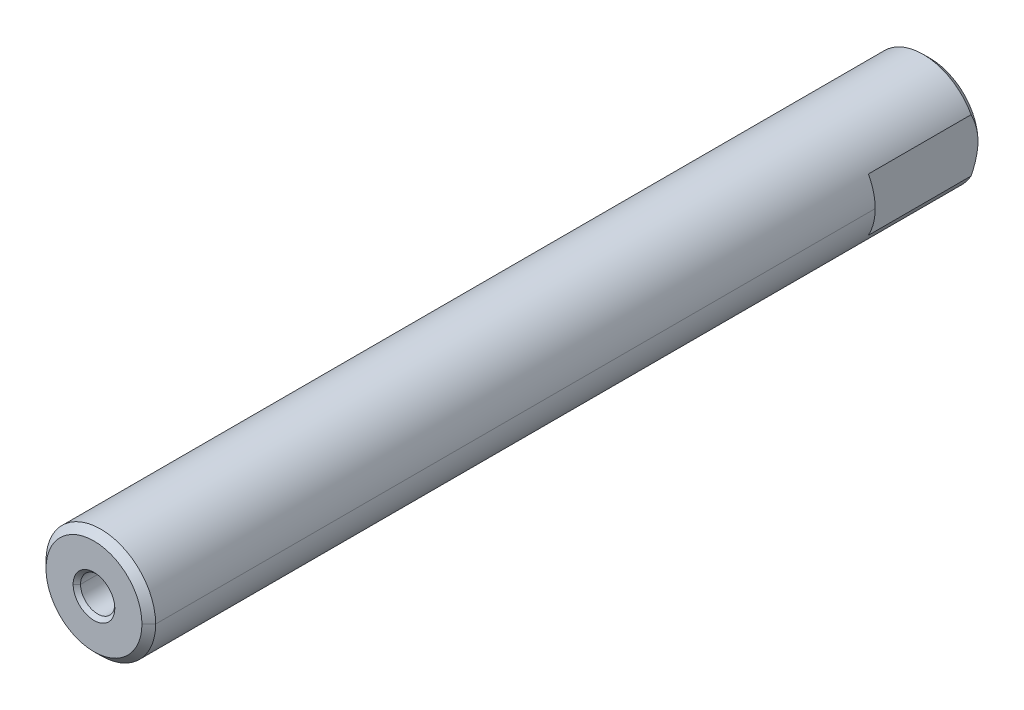
ISO-10303-21;
HEADER;
FILE_DESCRIPTION(('STEP AP214'),'2;1');
FILE_NAME('part.step','',(''),(''),'','','');
FILE_SCHEMA(('AUTOMOTIVE_DESIGN { 1 0 10303 214 1 1 1 1 }'));
ENDSEC;
DATA;
#1=APPLICATION_CONTEXT('core data for automotive mechanical design processes');
#2=APPLICATION_PROTOCOL_DEFINITION('international standard','automotive_design',2000,#1);
#3=PRODUCT_CONTEXT('',#1,'mechanical');
#4=PRODUCT('Part','Part','',(#3));
#5=PRODUCT_RELATED_PRODUCT_CATEGORY('part','',(#4));
#6=PRODUCT_DEFINITION_FORMATION('','',#4);
#7=PRODUCT_DEFINITION_CONTEXT('part definition',#1,'design');
#8=PRODUCT_DEFINITION('design','',#6,#7);
#9=PRODUCT_DEFINITION_SHAPE('','',#8);
#10=(LENGTH_UNIT() NAMED_UNIT(*) SI_UNIT(.MILLI.,.METRE.));
#11=(NAMED_UNIT(*) PLANE_ANGLE_UNIT() SI_UNIT($,.RADIAN.));
#12=(NAMED_UNIT(*) SI_UNIT($,.STERADIAN.) SOLID_ANGLE_UNIT());
#13=UNCERTAINTY_MEASURE_WITH_UNIT(LENGTH_MEASURE(1.E-05),#10,'distance_accuracy_value','');
#14=(GEOMETRIC_REPRESENTATION_CONTEXT(3) GLOBAL_UNCERTAINTY_ASSIGNED_CONTEXT((#13)) GLOBAL_UNIT_ASSIGNED_CONTEXT((#10,
#11,#12)) REPRESENTATION_CONTEXT('',''));
#15=CARTESIAN_POINT('',(0.,0.,0.));
#16=DIRECTION('',(0.,0.,1.));
#17=DIRECTION('',(1.,0.,0.));
#18=AXIS2_PLACEMENT_3D('',#15,#16,#17);
#19=CARTESIAN_POINT('',(3.5,4.88621935412864,8.));
#20=DIRECTION('',(1.,0.,0.));
#21=DIRECTION('',(0.,-1.,0.));
#22=AXIS2_PLACEMENT_3D('',#19,#20,#21);
#23=PLANE('',#22);
#24=DIRECTION('',(0.,0.,-1.));
#25=VECTOR('',#24,1.);
#26=CARTESIAN_POINT('',(3.5,-1.93649167310371,61.));
#27=LINE('',#26,#25);
#28=CARTESIAN_POINT('',(3.5,-1.93649167310371,8.));
#29=VERTEX_POINT('',#28);
#30=CARTESIAN_POINT('',(3.5,-1.93649167310371,0.500000000000063));
#31=VERTEX_POINT('',#30);
#32=EDGE_CURVE('E286',#29,#31,#27,.T.);
#33=ORIENTED_EDGE('',*,*,#32,.T.);
#34=CARTESIAN_POINT('',(3.49999999999997,0.,0.));
#35=CARTESIAN_POINT('',(3.4999942341956,-0.055561953894157,-1.30702272290945E-05));
#36=CARTESIAN_POINT('',(3.49999572668374,-0.111121671784973,0.00131852479242001));
#37=CARTESIAN_POINT('',(3.50000799050647,-0.22225127692022,0.00661908997414918));
#38=CARTESIAN_POINT('',(3.50001878443972,-0.277820859120701,0.0105944780899212));
#39=CARTESIAN_POINT('',(3.50004450680764,-0.389217556624111,0.0211781292325258));
#40=CARTESIAN_POINT('',(3.50005947197885,-0.44504241253058,0.0278100263985487));
#41=CARTESIAN_POINT('',(3.50005921828747,-0.555633468360331,0.0434708609195584));
#42=CARTESIAN_POINT('',(3.50004437853958,-0.610404130822807,0.0524684418748173));
#43=CARTESIAN_POINT('',(3.50001919201982,-0.719999500198233,0.0728991674522436));
#44=CARTESIAN_POINT('',(3.50000888698477,-0.774820237876483,0.0843535501568819));
#45=CARTESIAN_POINT('',(3.5000011573234,-0.88472023903095,0.109686665736827));
#46=CARTESIAN_POINT('',(3.5000039184471,-0.939792043411463,0.12359763742228));
#47=CARTESIAN_POINT('',(3.49999629995618,-1.04630054982865,0.152703499742868));
#48=CARTESIAN_POINT('',(3.49998664419175,-1.09776877426429,0.167783612004996));
#49=CARTESIAN_POINT('',(3.49996326392522,-1.20089778451425,0.199927441460859));
#50=CARTESIAN_POINT('',(3.49994948262865,-1.25255060021071,0.217016680074359));
#51=CARTESIAN_POINT('',(3.49993156376788,-1.3561763762825,0.253176782733719));
#52=CARTESIAN_POINT('',(3.49992760004896,-1.40813899389329,0.27227720892909));
#53=CARTESIAN_POINT('',(3.49993019638309,-1.51250518018266,0.312455524129849));
#54=CARTESIAN_POINT('',(3.49993697160304,-1.56489630236569,0.333565673385698));
#55=CARTESIAN_POINT('',(3.49995658221917,-1.67023045290168,0.377760651516999));
#56=CARTESIAN_POINT('',(3.49996955094969,-1.72315924712211,0.400879296628176));
#57=CARTESIAN_POINT('',(3.49999114662065,-1.82967262935075,0.44909286941947));
#58=CARTESIAN_POINT('',(3.49999965968975,-1.88324162537051,0.474222290335893));
#59=CARTESIAN_POINT('',(3.5,-1.9364916731037,0.500000000000063));
#60=B_SPLINE_CURVE_WITH_KNOTS('',3,(#34,#35,#36,#37,#38,#39,#40,#41,#42,#43,#44,#45,#46,#47,#48,
#49,#50,#51,#52,#53,#54,#55,#56,#57,#58,#59),.UNSPECIFIED.,.F.,.F.,(4,2,2,2,2,2,2,2,2,2,2,2,4),
(0.,0.166666050412799,0.333738175955924,0.502330930544102,0.668792788660832,0.836756231226204,
1.0071145760917,1.16797762335205,1.33116587892634,1.49722377746485,1.66665111117138,
1.8399026403733,2.01738884059167),.UNSPECIFIED.);
#61=CARTESIAN_POINT('',(3.5,0.,0.));
#62=VERTEX_POINT('',#61);
#63=EDGE_CURVE('E51',#62,#31,#60,.T.);
#64=ORIENTED_EDGE('',*,*,#63,.F.);
#65=CARTESIAN_POINT('',(3.49999999999964,1.93649167310487,0.500000000000311));
#66=CARTESIAN_POINT('',(3.49999633796739,1.85725073251888,0.461643561513497));
#67=CARTESIAN_POINT('',(3.49998014987611,1.77729228376771,0.424713309217628));
#68=CARTESIAN_POINT('',(3.49994945600047,1.61864369549973,0.355478896279381));
#69=CARTESIAN_POINT('',(3.49993491163544,1.54000355663685,0.323059791368042));
#70=CARTESIAN_POINT('',(3.49993056595035,1.38363011274289,0.262831423624858));
#71=CARTESIAN_POINT('',(3.49994004639073,1.30593864551991,0.234914272907894));
#72=CARTESIAN_POINT('',(3.49998004272969,1.15106355267365,0.183693271237578));
#73=CARTESIAN_POINT('',(3.50001005861693,1.0739109626771,0.160296356994321));
#74=CARTESIAN_POINT('',(3.49999457224086,0.954244897450834,0.12752215635427));
#75=CARTESIAN_POINT('',(3.49997747550559,0.912136997919795,0.116649537344201));
#76=CARTESIAN_POINT('',(3.4999240853316,0.828273762022956,0.0963700135039439));
#77=CARTESIAN_POINT('',(3.49988810032717,0.786523409587415,0.0869426158520726));
#78=CARTESIAN_POINT('',(3.49982274348475,0.70328576034914,0.0695567359412281));
#79=CARTESIAN_POINT('',(3.49979329148972,0.661802138464275,0.0615806933901363));
#80=CARTESIAN_POINT('',(3.49975199189955,0.579005667524726,0.0470927424215608));
#81=CARTESIAN_POINT('',(3.49973997165659,0.53769524167025,0.0405670248487648));
#82=CARTESIAN_POINT('',(3.49973858613423,0.455150110796149,0.028976234660021));
#83=CARTESIAN_POINT('',(3.49974907048818,0.413916734199194,0.0239017225161323));
#84=CARTESIAN_POINT('',(3.49978885777361,0.331428306803378,0.0152083365793653));
#85=CARTESIAN_POINT('',(3.49981810111436,0.29017373652406,0.0115849121837542));
#86=CARTESIAN_POINT('',(3.49988377923514,0.207543637940664,0.00578988180791815));
#87=CARTESIAN_POINT('',(3.49992021733093,0.166168062564707,0.00361894725006357));
#88=CARTESIAN_POINT('',(3.49997761254113,0.0831949939427846,0.000719101245024152));
#89=CARTESIAN_POINT('',(3.49999850500245,0.0415972906387628,-3.80881941001549E-06));
#90=CARTESIAN_POINT('',(3.49999999999997,0.,0.));
#91=B_SPLINE_CURVE_WITH_KNOTS('',3,(#65,#66,#67,#68,#69,#70,#71,#72,#73,#74,#75,#76,#77,#78,#79,
#80,#81,#82,#83,#84,#85,#86,#87,#88,#89,#90),.UNSPECIFIED.,.F.,.F.,(4,2,2,2,2,2,2,2,2,2,2,2,4),
(0.,0.264129868689977,0.519235667289697,0.766805409862119,1.00855216360748,1.13900182260998,
1.26738470409698,1.39409256108054,1.51953669763264,1.64414527718829,1.76835996604524,
1.89263203430898,2.01741809508854),.UNSPECIFIED.);
#92=CARTESIAN_POINT('',(3.5,1.93649167310507,0.499999999999898));
#93=VERTEX_POINT('',#92);
#94=EDGE_CURVE('E335',#93,#62,#91,.T.);
#95=ORIENTED_EDGE('',*,*,#94,.F.);
#96=DIRECTION('',(0.,0.,1.));
#97=VECTOR('',#96,1.);
#98=CARTESIAN_POINT('',(3.5,1.93649167310371,61.));
#99=LINE('',#98,#97);
#100=CARTESIAN_POINT('',(3.5,1.93649167310371,8.));
#101=VERTEX_POINT('',#100);
#102=EDGE_CURVE('E216',#93,#101,#99,.T.);
#103=ORIENTED_EDGE('',*,*,#102,.T.);
#104=DIRECTION('',(0.,-1.,0.));
#105=VECTOR('',#104,1.);
#106=CARTESIAN_POINT('',(3.5,4.88621935412864,8.));
#107=LINE('',#106,#105);
#108=EDGE_CURVE('E9',#101,#29,#107,.T.);
#109=ORIENTED_EDGE('',*,*,#108,.T.);
#110=EDGE_LOOP('',(#33,#64,#95,#103,#109));
#111=FACE_BOUND('',#110,.T.);
#112=ADVANCED_FACE('F15',(#111),#23,.T.);
#113=CARTESIAN_POINT('',(0.,0.,8.));
#114=DIRECTION('',(0.,0.,-1.));
#115=DIRECTION('',(0.,-1.,0.));
#116=AXIS2_PLACEMENT_3D('',#113,#114,#115);
#117=PLANE('',#116);
#118=CARTESIAN_POINT('',(0.,0.,8.));
#119=DIRECTION('',(0.,0.,-1.));
#120=DIRECTION('',(-1.,0.,0.));
#121=AXIS2_PLACEMENT_3D('',#118,#119,#120);
#122=CIRCLE('',#121,4.);
#123=CARTESIAN_POINT('',(4.,0.,8.));
#124=VERTEX_POINT('',#123);
#125=EDGE_CURVE('E212',#101,#124,#122,.T.);
#126=ORIENTED_EDGE('',*,*,#125,.T.);
#127=CARTESIAN_POINT('',(0.,0.,8.));
#128=DIRECTION('',(0.,0.,-1.));
#129=DIRECTION('',(-1.,0.,0.));
#130=AXIS2_PLACEMENT_3D('',#127,#128,#129);
#131=CIRCLE('',#130,4.);
#132=EDGE_CURVE('E411',#124,#29,#131,.T.);
#133=ORIENTED_EDGE('',*,*,#132,.T.);
#134=ORIENTED_EDGE('',*,*,#108,.F.);
#135=EDGE_LOOP('',(#126,#133,#134));
#136=FACE_BOUND('',#135,.T.);
#137=ADVANCED_FACE('F17',(#136),#117,.T.);
#138=CARTESIAN_POINT('',(0.,0.,8.));
#139=DIRECTION('',(0.,0.,-1.));
#140=DIRECTION('',(0.,-1.,0.));
#141=AXIS2_PLACEMENT_3D('',#138,#139,#140);
#142=PLANE('',#141);
#143=CARTESIAN_POINT('',(0.,0.,8.));
#144=DIRECTION('',(0.,0.,-1.));
#145=DIRECTION('',(-1.,0.,0.));
#146=AXIS2_PLACEMENT_3D('',#143,#144,#145);
#147=CIRCLE('',#146,4.);
#148=CARTESIAN_POINT('',(-3.5,-1.93649167310371,8.));
#149=VERTEX_POINT('',#148);
#150=CARTESIAN_POINT('',(-4.,0.,8.));
#151=VERTEX_POINT('',#150);
#152=EDGE_CURVE('E229',#149,#151,#147,.T.);
#153=ORIENTED_EDGE('',*,*,#152,.T.);
#154=CARTESIAN_POINT('',(0.,0.,8.));
#155=DIRECTION('',(0.,0.,-1.));
#156=DIRECTION('',(-1.,0.,0.));
#157=AXIS2_PLACEMENT_3D('',#154,#155,#156);
#158=CIRCLE('',#157,4.);
#159=CARTESIAN_POINT('',(-3.5,1.93649167310371,8.));
#160=VERTEX_POINT('',#159);
#161=EDGE_CURVE('E217',#151,#160,#158,.T.);
#162=ORIENTED_EDGE('',*,*,#161,.T.);
#163=DIRECTION('',(0.,1.,0.));
#164=VECTOR('',#163,1.);
#165=CARTESIAN_POINT('',(-3.5,4.88621935412864,8.));
#166=LINE('',#165,#164);
#167=EDGE_CURVE('E25',#149,#160,#166,.T.);
#168=ORIENTED_EDGE('',*,*,#167,.F.);
#169=EDGE_LOOP('',(#153,#162,#168));
#170=FACE_BOUND('',#169,.T.);
#171=ADVANCED_FACE('F377',(#170),#142,.T.);
#172=CARTESIAN_POINT('',(-3.5,4.88621935412864,8.));
#173=DIRECTION('',(-1.,0.,0.));
#174=DIRECTION('',(0.,0.,1.));
#175=AXIS2_PLACEMENT_3D('',#172,#173,#174);
#176=PLANE('',#175);
#177=DIRECTION('',(0.,0.,-1.));
#178=VECTOR('',#177,1.);
#179=CARTESIAN_POINT('',(-3.5,1.93649167310371,61.));
#180=LINE('',#179,#178);
#181=CARTESIAN_POINT('',(-3.5,1.93649167310371,0.500000000000063));
#182=VERTEX_POINT('',#181);
#183=EDGE_CURVE('E222',#160,#182,#180,.T.);
#184=ORIENTED_EDGE('',*,*,#183,.T.);
#185=CARTESIAN_POINT('',(-3.49999999999997,0.,0.));
#186=CARTESIAN_POINT('',(-3.49999423419557,0.0555619538928818,-1.3070227256217E-05));
#187=CARTESIAN_POINT('',(-3.49999572668382,0.1111216717824,0.00131852479243683));
#188=CARTESIAN_POINT('',(-3.50000799050676,0.222251276916345,0.00661908997419387));
#189=CARTESIAN_POINT('',(-3.50001878444012,0.277820859116819,0.0105944780900109));
#190=CARTESIAN_POINT('',(-3.50004450680798,0.389217556621518,0.0211781292325566));
#191=CARTESIAN_POINT('',(-3.50005947197903,0.445042412529279,0.0278100263985332));
#192=CARTESIAN_POINT('',(-3.5000592182873,0.555633468358975,0.0434708609192029));
#193=CARTESIAN_POINT('',(-3.50004437853925,0.61040413082012,0.0524684418740505));
#194=CARTESIAN_POINT('',(-3.50001919201944,0.719999500194203,0.0728991674510623));
#195=CARTESIAN_POINT('',(-3.50000888698452,0.774820237872428,0.0843535501557578));
#196=CARTESIAN_POINT('',(-3.50000115732333,0.884720239028243,0.109686665736073));
#197=CARTESIAN_POINT('',(-3.50000391844709,0.939792043410115,0.123597637421897));
#198=CARTESIAN_POINT('',(-3.49999629995619,1.04630054982861,0.152703499742867));
#199=CARTESIAN_POINT('',(-3.49998664419173,1.09776877426421,0.167783612004958));
#200=CARTESIAN_POINT('',(-3.49996326392518,1.20089778451411,0.199927441460775));
#201=CARTESIAN_POINT('',(-3.49994948262861,1.25255060021055,0.217016680074267));
#202=CARTESIAN_POINT('',(-3.49993156376785,1.3561763762823,0.253176782733614));
#203=CARTESIAN_POINT('',(-3.49992760004892,1.40813899389308,0.272277208928979));
#204=CARTESIAN_POINT('',(-3.49993019638307,1.51250518018245,0.312455524129737));
#205=CARTESIAN_POINT('',(-3.49993697160302,1.56489630236548,0.333565673385591));
#206=CARTESIAN_POINT('',(-3.49995658221916,1.6702304529015,0.37776065151691));
#207=CARTESIAN_POINT('',(-3.49996955094968,1.72315924712196,0.400879296628099));
#208=CARTESIAN_POINT('',(-3.49999114662065,1.82967262935066,0.449092869419428));
#209=CARTESIAN_POINT('',(-3.49999965968974,1.88324162537047,0.474222290335872));
#210=CARTESIAN_POINT('',(-3.5,1.93649167310371,0.500000000000063));
#211=B_SPLINE_CURVE_WITH_KNOTS('',3,(#185,#186,#187,#188,#189,#190,#191,#192,#193,#194,#195,
#196,#197,#198,#199,#200,#201,#202,#203,#204,#205,#206,#207,#208,#209,#210),.UNSPECIFIED.,.F.,
.F.,(4,2,2,2,2,2,2,2,2,2,2,2,4),(0.,0.166666050408926,0.333738175952042,0.502330930544058,
0.668792788656644,0.836756231221973,1.0071145760917,1.16797762335191,1.33116587892612,
1.49722377746459,1.66665111117115,1.83990264037315,2.01738884059167),.UNSPECIFIED.);
#212=CARTESIAN_POINT('',(-3.5,0.,0.));
#213=VERTEX_POINT('',#212);
#214=EDGE_CURVE('E363',#213,#182,#211,.T.);
#215=ORIENTED_EDGE('',*,*,#214,.F.);
#216=CARTESIAN_POINT('',(-3.49999999999964,-1.93649167310488,0.500000000000311));
#217=CARTESIAN_POINT('',(-3.49999633796739,-1.85725073251929,0.461643561513691));
#218=CARTESIAN_POINT('',(-3.49998014987615,-1.77729228376851,0.424713309218027));
#219=CARTESIAN_POINT('',(-3.49994945600059,-1.61864369550105,0.355478896280046));
#220=CARTESIAN_POINT('',(-3.49993491163561,-1.54000355663829,0.323059791368778));
#221=CARTESIAN_POINT('',(-3.49993056595059,-1.3836301127443,0.262831423625601));
#222=CARTESIAN_POINT('',(-3.49994004639099,-1.30593864552117,0.234914272908584));
#223=CARTESIAN_POINT('',(-3.49998004272989,-1.1510635526744,0.183693271237994));
#224=CARTESIAN_POINT('',(-3.50001005861704,-1.07391096267747,0.160296356994531));
#225=CARTESIAN_POINT('',(-3.49999457224081,-0.954244897451058,0.127522156354275));
#226=CARTESIAN_POINT('',(-3.49997747550546,-0.912136997920249,0.116649537344198));
#227=CARTESIAN_POINT('',(-3.49992408533139,-0.828273762023803,0.0963700135039336));
#228=CARTESIAN_POINT('',(-3.49988810032693,-0.786523409588425,0.0869426158520655));
#229=CARTESIAN_POINT('',(-3.49982274348449,-0.703285760350409,0.0695567359412227));
#230=CARTESIAN_POINT('',(-3.49979329148946,-0.661802138465642,0.0615806933901312));
#231=CARTESIAN_POINT('',(-3.4997519918993,-0.579005667526224,0.0470927424215552));
#232=CARTESIAN_POINT('',(-3.49973997165635,-0.537695241671781,0.0405670248487603));
#233=CARTESIAN_POINT('',(-3.49973858613403,-0.455150110797682,0.0289762346600165));
#234=CARTESIAN_POINT('',(-3.499749070488,-0.413916734200694,0.0239017225161289));
#235=CARTESIAN_POINT('',(-3.49978885777348,-0.331428306804749,0.0152083365793619));
#236=CARTESIAN_POINT('',(-3.49981810111425,-0.290173736525333,0.0115849121837519));
#237=CARTESIAN_POINT('',(-3.49988377923508,-0.207543637941677,0.00578988180791588));
#238=CARTESIAN_POINT('',(-3.49992021733089,-0.166168062565557,0.00361894725006244));
#239=CARTESIAN_POINT('',(-3.49997761254112,-0.0831949939432458,0.000719101245023057));
#240=CARTESIAN_POINT('',(-3.49999850500245,-0.0415972906389969,-3.80881940995658E-06));
#241=CARTESIAN_POINT('',(-3.49999999999997,0.,0.));
#242=B_SPLINE_CURVE_WITH_KNOTS('',3,(#216,#217,#218,#219,#220,#221,#222,#223,#224,#225,#226,
#227,#228,#229,#230,#231,#232,#233,#234,#235,#236,#237,#238,#239,#240,#241),.UNSPECIFIED.,.F.,
.F.,(4,2,2,2,2,2,2,2,2,2,2,2,4),(0.,0.26412986868864,0.519235667287953,0.766805409860841,
1.00855216360746,1.1390018226093,1.26738470409582,1.39409256107909,1.51953669763109,
1.64414527718685,1.76835996604408,1.89263203430831,2.01741809508855),.UNSPECIFIED.);
#243=CARTESIAN_POINT('',(-3.5,-1.93649167310507,0.499999999999898));
#244=VERTEX_POINT('',#243);
#245=EDGE_CURVE('E39',#244,#213,#242,.T.);
#246=ORIENTED_EDGE('',*,*,#245,.F.);
#247=DIRECTION('',(0.,0.,1.));
#248=VECTOR('',#247,1.);
#249=CARTESIAN_POINT('',(-3.5,-1.9364916731037,61.));
#250=LINE('',#249,#248);
#251=EDGE_CURVE('E232',#244,#149,#250,.T.);
#252=ORIENTED_EDGE('',*,*,#251,.T.);
#253=ORIENTED_EDGE('',*,*,#167,.T.);
#254=EDGE_LOOP('',(#184,#215,#246,#252,#253));
#255=FACE_BOUND('',#254,.T.);
#256=ADVANCED_FACE('F367',(#255),#176,.T.);
#257=CARTESIAN_POINT('',(0.,0.,61.));
#258=DIRECTION('',(0.,0.,-1.));
#259=DIRECTION('',(-1.,0.,0.));
#260=AXIS2_PLACEMENT_3D('',#257,#258,#259);
#261=CONICAL_SURFACE('',#260,3.50000000000005,0.785398163397446);
#262=DIRECTION('',(0.707106781186546,0.,-0.707106781186549));
#263=VECTOR('',#262,1.);
#264=CARTESIAN_POINT('',(3.50000000000005,0.,61.));
#265=LINE('',#264,#263);
#266=CARTESIAN_POINT('',(3.50000000000005,0.,61.));
#267=VERTEX_POINT('',#266);
#268=CARTESIAN_POINT('',(4.,0.,60.5));
#269=VERTEX_POINT('',#268);
#270=EDGE_CURVE('E451',#267,#269,#265,.T.);
#271=ORIENTED_EDGE('',*,*,#270,.F.);
#272=CARTESIAN_POINT('',(0.,0.,61.));
#273=DIRECTION('',(0.,0.,1.));
#274=DIRECTION('',(1.,0.,0.));
#275=AXIS2_PLACEMENT_3D('',#272,#273,#274);
#276=CIRCLE('',#275,3.50000000000005);
#277=CARTESIAN_POINT('',(-3.50000000000005,0.,61.));
#278=VERTEX_POINT('',#277);
#279=EDGE_CURVE('E235',#278,#267,#276,.T.);
#280=ORIENTED_EDGE('',*,*,#279,.F.);
#281=DIRECTION('',(-0.707106781186546,0.,-0.707106781186549));
#282=VECTOR('',#281,1.);
#283=CARTESIAN_POINT('',(-3.50000000000005,0.,61.));
#284=LINE('',#283,#282);
#285=CARTESIAN_POINT('',(-4.,0.,60.5));
#286=VERTEX_POINT('',#285);
#287=EDGE_CURVE('E450',#278,#286,#284,.T.);
#288=ORIENTED_EDGE('',*,*,#287,.T.);
#289=CARTESIAN_POINT('',(0.,0.,60.5));
#290=DIRECTION('',(0.,0.,-1.));
#291=DIRECTION('',(1.,0.,0.));
#292=AXIS2_PLACEMENT_3D('',#289,#290,#291);
#293=CIRCLE('',#292,4.);
#294=EDGE_CURVE('E226',#269,#286,#293,.T.);
#295=ORIENTED_EDGE('',*,*,#294,.F.);
#296=EDGE_LOOP('',(#271,#280,#288,#295));
#297=FACE_BOUND('',#296,.T.);
#298=ADVANCED_FACE('F376',(#297),#261,.T.);
#299=CARTESIAN_POINT('',(0.,0.,60.7295));
#300=DIRECTION('',(0.,0.,1.));
#301=DIRECTION('',(1.,0.,0.));
#302=AXIS2_PLACEMENT_3D('',#299,#300,#301);
#303=CONICAL_SURFACE('',#302,1.25,0.785398163397438);
#304=DIRECTION('',(-0.70710678118654,0.,0.707106781186555));
#305=VECTOR('',#304,1.);
#306=CARTESIAN_POINT('',(-1.25,0.,60.7295));
#307=LINE('',#306,#305);
#308=CARTESIAN_POINT('',(-1.25,0.,60.7295));
#309=VERTEX_POINT('',#308);
#310=CARTESIAN_POINT('',(-1.5205,0.,61.));
#311=VERTEX_POINT('',#310);
#312=EDGE_CURVE('E424',#309,#311,#307,.T.);
#313=ORIENTED_EDGE('',*,*,#312,.F.);
#314=CARTESIAN_POINT('',(0.,0.,60.7295));
#315=DIRECTION('',(0.,0.,1.));
#316=DIRECTION('',(1.,0.,0.));
#317=AXIS2_PLACEMENT_3D('',#314,#315,#316);
#318=CIRCLE('',#317,1.25);
#319=CARTESIAN_POINT('',(1.25,0.,60.7295));
#320=VERTEX_POINT('',#319);
#321=EDGE_CURVE('E242',#320,#309,#318,.T.);
#322=ORIENTED_EDGE('',*,*,#321,.F.);
#323=DIRECTION('',(0.70710678118654,0.,0.707106781186555));
#324=VECTOR('',#323,1.);
#325=CARTESIAN_POINT('',(1.25,0.,60.7295));
#326=LINE('',#325,#324);
#327=CARTESIAN_POINT('',(1.5205,0.,61.));
#328=VERTEX_POINT('',#327);
#329=EDGE_CURVE('E432',#320,#328,#326,.T.);
#330=ORIENTED_EDGE('',*,*,#329,.T.);
#331=CARTESIAN_POINT('',(0.,0.,61.));
#332=DIRECTION('',(0.,0.,-1.));
#333=DIRECTION('',(1.,0.,0.));
#334=AXIS2_PLACEMENT_3D('',#331,#332,#333);
#335=CIRCLE('',#334,1.5205);
#336=EDGE_CURVE('E167',#311,#328,#335,.T.);
#337=ORIENTED_EDGE('',*,*,#336,.F.);
#338=EDGE_LOOP('',(#313,#322,#330,#337));
#339=FACE_BOUND('',#338,.T.);
#340=ADVANCED_FACE('F481',(#339),#303,.F.);
#341=CARTESIAN_POINT('',(0.,0.,0.));
#342=DIRECTION('',(0.,0.,-1.));
#343=DIRECTION('',(-1.,0.,0.));
#344=AXIS2_PLACEMENT_3D('',#341,#342,#343);
#345=CONICAL_SURFACE('',#344,1.5205,0.785398163397453);
#346=DIRECTION('',(0.707106781186551,0.,-0.707106781186544));
#347=VECTOR('',#346,1.);
#348=CARTESIAN_POINT('',(1.5205,0.,0.));
#349=LINE('',#348,#347);
#350=CARTESIAN_POINT('',(1.25,0.,0.270500000000005));
#351=VERTEX_POINT('',#350);
#352=CARTESIAN_POINT('',(1.5205,0.,0.));
#353=VERTEX_POINT('',#352);
#354=EDGE_CURVE('E181',#351,#353,#349,.T.);
#355=ORIENTED_EDGE('',*,*,#354,.F.);
#356=CARTESIAN_POINT('',(0.,0.,0.270500000000005));
#357=DIRECTION('',(0.,0.,-1.));
#358=DIRECTION('',(1.,0.,0.));
#359=AXIS2_PLACEMENT_3D('',#356,#357,#358);
#360=CIRCLE('',#359,1.25);
#361=CARTESIAN_POINT('',(-1.25,0.,0.270500000000005));
#362=VERTEX_POINT('',#361);
#363=EDGE_CURVE('E172',#362,#351,#360,.T.);
#364=ORIENTED_EDGE('',*,*,#363,.F.);
#365=DIRECTION('',(-0.707106781186551,0.,-0.707106781186544));
#366=VECTOR('',#365,1.);
#367=CARTESIAN_POINT('',(-1.5205,0.,0.));
#368=LINE('',#367,#366);
#369=CARTESIAN_POINT('',(-1.5205,0.,0.));
#370=VERTEX_POINT('',#369);
#371=EDGE_CURVE('E170',#362,#370,#368,.T.);
#372=ORIENTED_EDGE('',*,*,#371,.T.);
#373=CARTESIAN_POINT('',(0.,0.,0.));
#374=DIRECTION('',(0.,0.,1.));
#375=DIRECTION('',(1.,0.,0.));
#376=AXIS2_PLACEMENT_3D('',#373,#374,#375);
#377=CIRCLE('',#376,1.5205);
#378=EDGE_CURVE('E156',#353,#370,#377,.T.);
#379=ORIENTED_EDGE('',*,*,#378,.F.);
#380=EDGE_LOOP('',(#355,#364,#372,#379));
#381=FACE_BOUND('',#380,.T.);
#382=ADVANCED_FACE('F171',(#381),#345,.F.);
#383=CARTESIAN_POINT('',(0.,0.,8.29014784));
#384=DIRECTION('',(0.,0.,1.));
#385=DIRECTION('',(1.,0.,0.));
#386=AXIS2_PLACEMENT_3D('',#383,#384,#385);
#387=PLANE('',#386);
#388=CARTESIAN_POINT('',(0.,0.,8.29014784));
#389=DIRECTION('',(0.,0.,1.));
#390=DIRECTION('',(1.,0.,0.));
#391=AXIS2_PLACEMENT_3D('',#388,#389,#390);
#392=CIRCLE('',#391,1.25);
#393=CARTESIAN_POINT('',(-1.25,0.,8.29014784));
#394=VERTEX_POINT('',#393);
#395=CARTESIAN_POINT('',(1.25,0.,8.29014784));
#396=VERTEX_POINT('',#395);
#397=EDGE_CURVE('E178',#394,#396,#392,.T.);
#398=ORIENTED_EDGE('',*,*,#397,.F.);
#399=CARTESIAN_POINT('',(0.,0.,8.29014784));
#400=DIRECTION('',(0.,0.,1.));
#401=DIRECTION('',(1.,0.,0.));
#402=AXIS2_PLACEMENT_3D('',#399,#400,#401);
#403=CIRCLE('',#402,1.25);
#404=EDGE_CURVE('E243',#396,#394,#403,.T.);
#405=ORIENTED_EDGE('',*,*,#404,.F.);
#406=EDGE_LOOP('',(#398,#405));
#407=FACE_BOUND('',#406,.T.);
#408=ADVANCED_FACE('F297',(#407),#387,.F.);
#409=CARTESIAN_POINT('',(0.,0.,8.29014784));
#410=DIRECTION('',(0.,0.,-1.));
#411=DIRECTION('',(-1.,0.,0.));
#412=AXIS2_PLACEMENT_3D('',#409,#410,#411);
#413=CYLINDRICAL_SURFACE('',#412,1.25);
#414=DIRECTION('',(0.,0.,-1.));
#415=VECTOR('',#414,1.);
#416=CARTESIAN_POINT('',(1.25,0.,8.29014784));
#417=LINE('',#416,#415);
#418=EDGE_CURVE('E191',#396,#351,#417,.T.);
#419=ORIENTED_EDGE('',*,*,#418,.F.);
#420=ORIENTED_EDGE('',*,*,#404,.T.);
#421=DIRECTION('',(0.,0.,-1.));
#422=VECTOR('',#421,1.);
#423=CARTESIAN_POINT('',(-1.25,0.,8.29014784));
#424=LINE('',#423,#422);
#425=EDGE_CURVE('E195',#394,#362,#424,.T.);
#426=ORIENTED_EDGE('',*,*,#425,.T.);
#427=ORIENTED_EDGE('',*,*,#363,.T.);
#428=EDGE_LOOP('',(#419,#420,#426,#427));
#429=FACE_BOUND('',#428,.T.);
#430=ADVANCED_FACE('F487',(#429),#413,.F.);
#431=CARTESIAN_POINT('',(0.,0.,52.70985216));
#432=DIRECTION('',(0.,0.,1.));
#433=DIRECTION('',(1.,0.,0.));
#434=AXIS2_PLACEMENT_3D('',#431,#432,#433);
#435=PLANE('',#434);
#436=CARTESIAN_POINT('',(0.,0.,52.70985216));
#437=DIRECTION('',(0.,0.,1.));
#438=DIRECTION('',(1.,0.,0.));
#439=AXIS2_PLACEMENT_3D('',#436,#437,#438);
#440=CIRCLE('',#439,1.25);
#441=CARTESIAN_POINT('',(1.25,0.,52.70985216));
#442=VERTEX_POINT('',#441);
#443=CARTESIAN_POINT('',(-1.25,0.,52.70985216));
#444=VERTEX_POINT('',#443);
#445=EDGE_CURVE('E166',#442,#444,#440,.T.);
#446=ORIENTED_EDGE('',*,*,#445,.T.);
#447=CARTESIAN_POINT('',(0.,0.,52.70985216));
#448=DIRECTION('',(0.,0.,1.));
#449=DIRECTION('',(1.,0.,0.));
#450=AXIS2_PLACEMENT_3D('',#447,#448,#449);
#451=CIRCLE('',#450,1.25);
#452=EDGE_CURVE('E196',#444,#442,#451,.T.);
#453=ORIENTED_EDGE('',*,*,#452,.T.);
#454=EDGE_LOOP('',(#446,#453));
#455=FACE_BOUND('',#454,.T.);
#456=ADVANCED_FACE('F485',(#455),#435,.T.);
#457=CARTESIAN_POINT('',(0.,0.,52.70985216));
#458=DIRECTION('',(0.,0.,1.));
#459=DIRECTION('',(1.,0.,0.));
#460=AXIS2_PLACEMENT_3D('',#457,#458,#459);
#461=CYLINDRICAL_SURFACE('',#460,1.25);
#462=DIRECTION('',(0.,0.,1.));
#463=VECTOR('',#462,1.);
#464=CARTESIAN_POINT('',(-1.25,0.,52.70985216));
#465=LINE('',#464,#463);
#466=EDGE_CURVE('E200',#444,#309,#465,.T.);
#467=ORIENTED_EDGE('',*,*,#466,.F.);
#468=ORIENTED_EDGE('',*,*,#445,.F.);
#469=DIRECTION('',(0.,0.,1.));
#470=VECTOR('',#469,1.);
#471=CARTESIAN_POINT('',(1.25,0.,52.70985216));
#472=LINE('',#471,#470);
#473=EDGE_CURVE('E204',#442,#320,#472,.T.);
#474=ORIENTED_EDGE('',*,*,#473,.T.);
#475=ORIENTED_EDGE('',*,*,#321,.T.);
#476=EDGE_LOOP('',(#467,#468,#474,#475));
#477=FACE_BOUND('',#476,.T.);
#478=ADVANCED_FACE('F483',(#477),#461,.F.);
#479=CARTESIAN_POINT('',(0.,0.,0.));
#480=DIRECTION('',(0.,0.,1.));
#481=DIRECTION('',(1.,0.,0.));
#482=AXIS2_PLACEMENT_3D('',#479,#480,#481);
#483=PLANE('',#482);
#484=CARTESIAN_POINT('',(0.,0.,0.));
#485=DIRECTION('',(0.,0.,1.));
#486=DIRECTION('',(1.,0.,0.));
#487=AXIS2_PLACEMENT_3D('',#484,#485,#486);
#488=CIRCLE('',#487,1.5205);
#489=EDGE_CURVE('E161',#370,#353,#488,.T.);
#490=ORIENTED_EDGE('',*,*,#489,.T.);
#491=ORIENTED_EDGE('',*,*,#378,.T.);
#492=EDGE_LOOP('',(#490,#491));
#493=FACE_BOUND('',#492,.T.);
#494=CARTESIAN_POINT('',(0.,0.,0.));
#495=DIRECTION('',(0.,0.,-1.));
#496=DIRECTION('',(1.,0.,0.));
#497=AXIS2_PLACEMENT_3D('',#494,#495,#496);
#498=CIRCLE('',#497,3.49999999999994);
#499=EDGE_CURVE('E399',#62,#213,#498,.T.);
#500=ORIENTED_EDGE('',*,*,#499,.T.);
#501=CARTESIAN_POINT('',(0.,0.,0.));
#502=DIRECTION('',(0.,0.,-1.));
#503=DIRECTION('',(1.,0.,0.));
#504=AXIS2_PLACEMENT_3D('',#501,#502,#503);
#505=CIRCLE('',#504,3.49999999999994);
#506=EDGE_CURVE('E404',#213,#62,#505,.T.);
#507=ORIENTED_EDGE('',*,*,#506,.T.);
#508=EDGE_LOOP('',(#500,#507));
#509=FACE_BOUND('',#508,.T.);
#510=ADVANCED_FACE('F158',(#493,#509),#483,.F.);
#511=CARTESIAN_POINT('',(0.,0.,61.));
#512=DIRECTION('',(0.,0.,1.));
#513=DIRECTION('',(1.,0.,0.));
#514=AXIS2_PLACEMENT_3D('',#511,#512,#513);
#515=PLANE('',#514);
#516=CARTESIAN_POINT('',(0.,0.,61.));
#517=DIRECTION('',(0.,0.,-1.));
#518=DIRECTION('',(1.,0.,0.));
#519=AXIS2_PLACEMENT_3D('',#516,#517,#518);
#520=CIRCLE('',#519,1.5205);
#521=EDGE_CURVE('E428',#328,#311,#520,.T.);
#522=ORIENTED_EDGE('',*,*,#521,.T.);
#523=ORIENTED_EDGE('',*,*,#336,.T.);
#524=EDGE_LOOP('',(#522,#523));
#525=FACE_BOUND('',#524,.T.);
#526=ORIENTED_EDGE('',*,*,#279,.T.);
#527=CARTESIAN_POINT('',(0.,0.,61.));
#528=DIRECTION('',(0.,0.,1.));
#529=DIRECTION('',(1.,0.,0.));
#530=AXIS2_PLACEMENT_3D('',#527,#528,#529);
#531=CIRCLE('',#530,3.50000000000005);
#532=EDGE_CURVE('E455',#267,#278,#531,.T.);
#533=ORIENTED_EDGE('',*,*,#532,.T.);
#534=EDGE_LOOP('',(#526,#533));
#535=FACE_BOUND('',#534,.T.);
#536=ADVANCED_FACE('F266',(#525,#535),#515,.T.);
#537=CARTESIAN_POINT('',(0.,0.,0.500000000000063));
#538=DIRECTION('',(0.,0.,1.));
#539=DIRECTION('',(1.,0.,0.));
#540=AXIS2_PLACEMENT_3D('',#537,#538,#539);
#541=CONICAL_SURFACE('',#540,4.,0.785398163397446);
#542=ORIENTED_EDGE('',*,*,#499,.F.);
#543=ORIENTED_EDGE('',*,*,#63,.T.);
#544=CARTESIAN_POINT('',(0.,0.,0.500000000000063));
#545=DIRECTION('',(0.,0.,1.));
#546=DIRECTION('',(1.,0.,0.));
#547=AXIS2_PLACEMENT_3D('',#544,#545,#546);
#548=CIRCLE('',#547,4.);
#549=EDGE_CURVE('E383',#244,#31,#548,.T.);
#550=ORIENTED_EDGE('',*,*,#549,.F.);
#551=ORIENTED_EDGE('',*,*,#245,.T.);
#552=EDGE_LOOP('',(#542,#543,#550,#551));
#553=FACE_BOUND('',#552,.T.);
#554=ADVANCED_FACE('F255',(#553),#541,.T.);
#555=CARTESIAN_POINT('',(0.,0.,0.500000000000063));
#556=DIRECTION('',(0.,0.,1.));
#557=DIRECTION('',(1.,0.,0.));
#558=AXIS2_PLACEMENT_3D('',#555,#556,#557);
#559=CONICAL_SURFACE('',#558,4.,0.785398163397446);
#560=CARTESIAN_POINT('',(0.,0.,0.500000000000063));
#561=DIRECTION('',(0.,0.,1.));
#562=DIRECTION('',(1.,0.,0.));
#563=AXIS2_PLACEMENT_3D('',#560,#561,#562);
#564=CIRCLE('',#563,4.);
#565=EDGE_CURVE('E313',#93,#182,#564,.T.);
#566=ORIENTED_EDGE('',*,*,#565,.F.);
#567=ORIENTED_EDGE('',*,*,#94,.T.);
#568=ORIENTED_EDGE('',*,*,#506,.F.);
#569=ORIENTED_EDGE('',*,*,#214,.T.);
#570=EDGE_LOOP('',(#566,#567,#568,#569));
#571=FACE_BOUND('',#570,.T.);
#572=ADVANCED_FACE('F265',(#571),#559,.T.);
#573=CARTESIAN_POINT('',(0.,0.,61.));
#574=DIRECTION('',(0.,0.,-1.));
#575=DIRECTION('',(-1.,0.,0.));
#576=AXIS2_PLACEMENT_3D('',#573,#574,#575);
#577=CYLINDRICAL_SURFACE('',#576,4.);
#578=DIRECTION('',(0.,0.,-1.));
#579=VECTOR('',#578,1.);
#580=CARTESIAN_POINT('',(4.,0.,61.));
#581=LINE('',#580,#579);
#582=EDGE_CURVE('E208',#269,#124,#581,.T.);
#583=ORIENTED_EDGE('',*,*,#582,.F.);
#584=ORIENTED_EDGE('',*,*,#294,.T.);
#585=DIRECTION('',(0.,0.,-1.));
#586=VECTOR('',#585,1.);
#587=CARTESIAN_POINT('',(-4.,0.,61.));
#588=LINE('',#587,#586);
#589=EDGE_CURVE('E221',#286,#151,#588,.T.);
#590=ORIENTED_EDGE('',*,*,#589,.T.);
#591=ORIENTED_EDGE('',*,*,#152,.F.);
#592=ORIENTED_EDGE('',*,*,#251,.F.);
#593=ORIENTED_EDGE('',*,*,#549,.T.);
#594=ORIENTED_EDGE('',*,*,#32,.F.);
#595=ORIENTED_EDGE('',*,*,#132,.F.);
#596=EDGE_LOOP('',(#583,#584,#590,#591,#592,#593,#594,#595));
#597=FACE_BOUND('',#596,.T.);
#598=ADVANCED_FACE('F347',(#597),#577,.T.);
#599=CARTESIAN_POINT('',(0.,0.,61.));
#600=DIRECTION('',(0.,0.,-1.));
#601=DIRECTION('',(-1.,0.,0.));
#602=AXIS2_PLACEMENT_3D('',#599,#600,#601);
#603=CYLINDRICAL_SURFACE('',#602,4.);
#604=CARTESIAN_POINT('',(0.,0.,60.5));
#605=DIRECTION('',(0.,0.,-1.));
#606=DIRECTION('',(1.,0.,0.));
#607=AXIS2_PLACEMENT_3D('',#604,#605,#606);
#608=CIRCLE('',#607,4.);
#609=EDGE_CURVE('E446',#286,#269,#608,.T.);
#610=ORIENTED_EDGE('',*,*,#609,.T.);
#611=ORIENTED_EDGE('',*,*,#582,.T.);
#612=ORIENTED_EDGE('',*,*,#125,.F.);
#613=ORIENTED_EDGE('',*,*,#102,.F.);
#614=ORIENTED_EDGE('',*,*,#565,.T.);
#615=ORIENTED_EDGE('',*,*,#183,.F.);
#616=ORIENTED_EDGE('',*,*,#161,.F.);
#617=ORIENTED_EDGE('',*,*,#589,.F.);
#618=EDGE_LOOP('',(#610,#611,#612,#613,#614,#615,#616,#617));
#619=FACE_BOUND('',#618,.T.);
#620=ADVANCED_FACE('F1093',(#619),#603,.T.);
#621=CARTESIAN_POINT('',(0.,0.,52.70985216));
#622=DIRECTION('',(0.,0.,1.));
#623=DIRECTION('',(1.,0.,0.));
#624=AXIS2_PLACEMENT_3D('',#621,#622,#623);
#625=CYLINDRICAL_SURFACE('',#624,1.25);
#626=ORIENTED_EDGE('',*,*,#452,.F.);
#627=ORIENTED_EDGE('',*,*,#466,.T.);
#628=CARTESIAN_POINT('',(0.,0.,60.7295));
#629=DIRECTION('',(0.,0.,1.));
#630=DIRECTION('',(1.,0.,0.));
#631=AXIS2_PLACEMENT_3D('',#628,#629,#630);
#632=CIRCLE('',#631,1.25);
#633=EDGE_CURVE('E422',#309,#320,#632,.T.);
#634=ORIENTED_EDGE('',*,*,#633,.T.);
#635=ORIENTED_EDGE('',*,*,#473,.F.);
#636=EDGE_LOOP('',(#626,#627,#634,#635));
#637=FACE_BOUND('',#636,.T.);
#638=ADVANCED_FACE('F474',(#637),#625,.F.);
#639=CARTESIAN_POINT('',(0.,0.,8.29014784));
#640=DIRECTION('',(0.,0.,-1.));
#641=DIRECTION('',(-1.,0.,0.));
#642=AXIS2_PLACEMENT_3D('',#639,#640,#641);
#643=CYLINDRICAL_SURFACE('',#642,1.25);
#644=ORIENTED_EDGE('',*,*,#397,.T.);
#645=ORIENTED_EDGE('',*,*,#418,.T.);
#646=CARTESIAN_POINT('',(0.,0.,0.270500000000005));
#647=DIRECTION('',(0.,0.,-1.));
#648=DIRECTION('',(1.,0.,0.));
#649=AXIS2_PLACEMENT_3D('',#646,#647,#648);
#650=CIRCLE('',#649,1.25);
#651=EDGE_CURVE('E187',#351,#362,#650,.T.);
#652=ORIENTED_EDGE('',*,*,#651,.T.);
#653=ORIENTED_EDGE('',*,*,#425,.F.);
#654=EDGE_LOOP('',(#644,#645,#652,#653));
#655=FACE_BOUND('',#654,.T.);
#656=ADVANCED_FACE('F1076',(#655),#643,.F.);
#657=CARTESIAN_POINT('',(0.,0.,0.));
#658=DIRECTION('',(0.,0.,-1.));
#659=DIRECTION('',(-1.,0.,0.));
#660=AXIS2_PLACEMENT_3D('',#657,#658,#659);
#661=CONICAL_SURFACE('',#660,1.5205,0.785398163397453);
#662=ORIENTED_EDGE('',*,*,#651,.F.);
#663=ORIENTED_EDGE('',*,*,#354,.T.);
#664=ORIENTED_EDGE('',*,*,#489,.F.);
#665=ORIENTED_EDGE('',*,*,#371,.F.);
#666=EDGE_LOOP('',(#662,#663,#664,#665));
#667=FACE_BOUND('',#666,.T.);
#668=ADVANCED_FACE('F180',(#667),#661,.F.);
#669=CARTESIAN_POINT('',(0.,0.,60.7295));
#670=DIRECTION('',(0.,0.,1.));
#671=DIRECTION('',(1.,0.,0.));
#672=AXIS2_PLACEMENT_3D('',#669,#670,#671);
#673=CONICAL_SURFACE('',#672,1.25,0.785398163397438);
#674=ORIENTED_EDGE('',*,*,#633,.F.);
#675=ORIENTED_EDGE('',*,*,#312,.T.);
#676=ORIENTED_EDGE('',*,*,#521,.F.);
#677=ORIENTED_EDGE('',*,*,#329,.F.);
#678=EDGE_LOOP('',(#674,#675,#676,#677));
#679=FACE_BOUND('',#678,.T.);
#680=ADVANCED_FACE('F478',(#679),#673,.F.);
#681=CARTESIAN_POINT('',(0.,0.,61.));
#682=DIRECTION('',(0.,0.,-1.));
#683=DIRECTION('',(-1.,0.,0.));
#684=AXIS2_PLACEMENT_3D('',#681,#682,#683);
#685=CONICAL_SURFACE('',#684,3.50000000000005,0.785398163397446);
#686=ORIENTED_EDGE('',*,*,#532,.F.);
#687=ORIENTED_EDGE('',*,*,#270,.T.);
#688=ORIENTED_EDGE('',*,*,#609,.F.);
#689=ORIENTED_EDGE('',*,*,#287,.F.);
#690=EDGE_LOOP('',(#686,#687,#688,#689));
#691=FACE_BOUND('',#690,.T.);
#692=ADVANCED_FACE('F267',(#691),#685,.T.);
#693=CLOSED_SHELL('',(#112,#137,#171,#256,#298,#340,#382,#408,#430,#456,#478,#510,#536,#554,
#572,#598,#620,#638,#656,#668,#680,#692));
#694=MANIFOLD_SOLID_BREP('B1',#693);
#695=ADVANCED_BREP_SHAPE_REPRESENTATION('',(#18,#694),#14);
#696=SHAPE_DEFINITION_REPRESENTATION(#9,#695);
ENDSEC;
END-ISO-10303-21;
